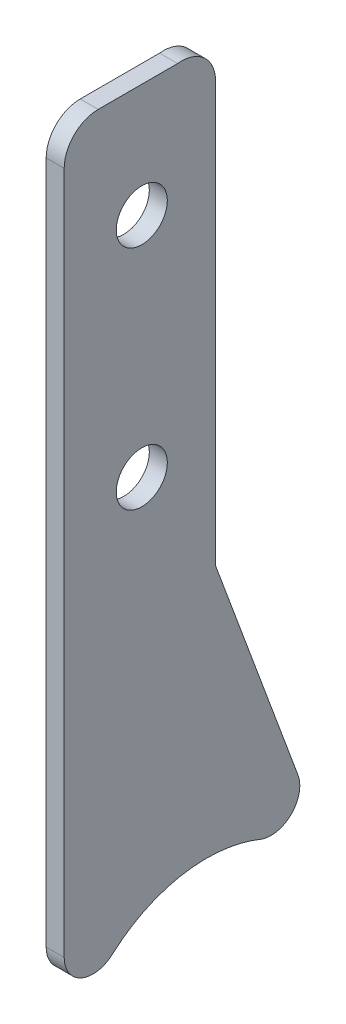
ISO-10303-21;
HEADER;
FILE_DESCRIPTION(('STEP AP214'),'2;1');
FILE_NAME('part.step','',(''),(''),'','','');
FILE_SCHEMA(('AUTOMOTIVE_DESIGN { 1 0 10303 214 1 1 1 1 }'));
ENDSEC;
DATA;
#1=APPLICATION_CONTEXT('core data for automotive mechanical design processes');
#2=APPLICATION_PROTOCOL_DEFINITION('international standard','automotive_design',2000,#1);
#3=PRODUCT_CONTEXT('',#1,'mechanical');
#4=PRODUCT('Part','Part','',(#3));
#5=PRODUCT_RELATED_PRODUCT_CATEGORY('part','',(#4));
#6=PRODUCT_DEFINITION_FORMATION('','',#4);
#7=PRODUCT_DEFINITION_CONTEXT('part definition',#1,'design');
#8=PRODUCT_DEFINITION('design','',#6,#7);
#9=PRODUCT_DEFINITION_SHAPE('','',#8);
#10=(LENGTH_UNIT() NAMED_UNIT(*) SI_UNIT(.MILLI.,.METRE.));
#11=(NAMED_UNIT(*) PLANE_ANGLE_UNIT() SI_UNIT($,.RADIAN.));
#12=(NAMED_UNIT(*) SI_UNIT($,.STERADIAN.) SOLID_ANGLE_UNIT());
#13=UNCERTAINTY_MEASURE_WITH_UNIT(LENGTH_MEASURE(1.E-05),#10,'distance_accuracy_value','');
#14=(GEOMETRIC_REPRESENTATION_CONTEXT(3) GLOBAL_UNCERTAINTY_ASSIGNED_CONTEXT((#13)) GLOBAL_UNIT_ASSIGNED_CONTEXT((#10,
#11,#12)) REPRESENTATION_CONTEXT('',''));
#15=CARTESIAN_POINT('',(0.,0.,0.));
#16=DIRECTION('',(0.,0.,1.));
#17=DIRECTION('',(1.,0.,0.));
#18=AXIS2_PLACEMENT_3D('',#15,#16,#17);
#19=CARTESIAN_POINT('',(1.5875,184.166822072846,-496.991027052738));
#20=DIRECTION('',(0.,0.347473746771921,-0.937689711634015));
#21=DIRECTION('',(0.,0.937689711634015,0.347473746771921));
#22=AXIS2_PLACEMENT_3D('',#19,#20,#21);
#23=PLANE('',#22);
#24=DIRECTION('',(0.,-0.937689711634015,-0.347473746771921));
#25=VECTOR('',#24,1.);
#26=CARTESIAN_POINT('',(1.5875,184.166822072846,-496.991027052738));
#27=LINE('',#26,#25);
#28=CARTESIAN_POINT('',(1.5875,94.5021210283801,-530.217508306128));
#29=VERTEX_POINT('',#28);
#30=CARTESIAN_POINT('',(1.5875,74.8875946446469,-537.48593931177));
#31=VERTEX_POINT('',#30);
#32=EDGE_CURVE('E120',#29,#31,#27,.T.);
#33=ORIENTED_EDGE('',*,*,#32,.T.);
#34=DIRECTION('',(1.,0.,0.));
#35=VECTOR('',#34,1.);
#36=CARTESIAN_POINT('',(0.,74.8875946446469,-537.48593931177));
#37=LINE('',#36,#35);
#38=CARTESIAN_POINT('',(0.,74.8875946446469,-537.48593931177));
#39=VERTEX_POINT('',#38);
#40=EDGE_CURVE('E12',#31,#39,#37,.F.);
#41=ORIENTED_EDGE('',*,*,#40,.T.);
#42=DIRECTION('',(0.,-0.937689711634015,-0.347473746771921));
#43=VECTOR('',#42,1.);
#44=CARTESIAN_POINT('',(0.,184.166822072846,-496.991027052738));
#45=LINE('',#44,#43);
#46=CARTESIAN_POINT('',(0.,94.5021210283801,-530.217508306128));
#47=VERTEX_POINT('',#46);
#48=EDGE_CURVE('E123',#47,#39,#45,.T.);
#49=ORIENTED_EDGE('',*,*,#48,.F.);
#50=DIRECTION('',(-1.,0.,0.));
#51=VECTOR('',#50,1.);
#52=CARTESIAN_POINT('',(1.5875,94.5021210283801,-530.217508306128));
#53=LINE('',#52,#51);
#54=EDGE_CURVE('E118',#29,#47,#53,.T.);
#55=ORIENTED_EDGE('',*,*,#54,.F.);
#56=EDGE_LOOP('',(#33,#41,#49,#55));
#57=FACE_BOUND('',#56,.T.);
#58=ADVANCED_FACE('F44',(#57),#23,.T.);
#59=CARTESIAN_POINT('',(1.5875,1.59097212373201E-12,-530.217508306128));
#60=DIRECTION('',(0.,0.,1.));
#61=DIRECTION('',(0.,-1.,0.));
#62=AXIS2_PLACEMENT_3D('',#59,#60,#61);
#63=PLANE('',#62);
#64=DIRECTION('',(0.,1.,0.));
#65=VECTOR('',#64,1.);
#66=CARTESIAN_POINT('',(0.,1.59097212373201E-12,-530.217508306128));
#67=LINE('',#66,#65);
#68=CARTESIAN_POINT('',(0.,131.50212102838,-530.217508306128));
#69=VERTEX_POINT('',#68);
#70=EDGE_CURVE('E207',#47,#69,#67,.T.);
#71=ORIENTED_EDGE('',*,*,#70,.T.);
#72=DIRECTION('',(-1.,0.,0.));
#73=VECTOR('',#72,1.);
#74=CARTESIAN_POINT('',(1.5875,131.50212102838,-530.217508306128));
#75=LINE('',#74,#73);
#76=CARTESIAN_POINT('',(1.5875,131.50212102838,-530.217508306128));
#77=VERTEX_POINT('',#76);
#78=EDGE_CURVE('E127',#77,#69,#75,.T.);
#79=ORIENTED_EDGE('',*,*,#78,.F.);
#80=DIRECTION('',(0.,1.,0.));
#81=VECTOR('',#80,1.);
#82=CARTESIAN_POINT('',(1.5875,1.59097212373201E-12,-530.217508306128));
#83=LINE('',#82,#81);
#84=EDGE_CURVE('E130',#29,#77,#83,.T.);
#85=ORIENTED_EDGE('',*,*,#84,.F.);
#86=ORIENTED_EDGE('',*,*,#54,.T.);
#87=EDGE_LOOP('',(#71,#79,#85,#86));
#88=FACE_BOUND('',#87,.T.);
#89=ADVANCED_FACE('F131',(#88),#63,.F.);
#90=CARTESIAN_POINT('',(1.5875,131.521457606697,-527.217570623985));
#91=DIRECTION('',(-1.,0.,0.));
#92=DIRECTION('',(0.,0.,1.));
#93=AXIS2_PLACEMENT_3D('',#90,#91,#92);
#94=CYLINDRICAL_SURFACE('',#93,3.);
#95=CARTESIAN_POINT('',(0.,131.521457606697,-527.217570623985));
#96=DIRECTION('',(1.,0.,0.));
#97=DIRECTION('',(0.,0.,-1.));
#98=AXIS2_PLACEMENT_3D('',#95,#96,#97);
#99=CIRCLE('',#98,3.);
#100=CARTESIAN_POINT('',(0.,134.50212102838,-526.877503620822));
#101=VERTEX_POINT('',#100);
#102=EDGE_CURVE('E205',#69,#101,#99,.T.);
#103=ORIENTED_EDGE('',*,*,#102,.T.);
#104=DIRECTION('',(-1.,0.,0.));
#105=VECTOR('',#104,1.);
#106=CARTESIAN_POINT('',(1.5875,134.50212102838,-526.877503620822));
#107=LINE('',#106,#105);
#108=CARTESIAN_POINT('',(1.5875,134.50212102838,-526.877503620822));
#109=VERTEX_POINT('',#108);
#110=EDGE_CURVE('E186',#109,#101,#107,.T.);
#111=ORIENTED_EDGE('',*,*,#110,.F.);
#112=CARTESIAN_POINT('',(1.5875,131.521457606697,-527.217570623985));
#113=DIRECTION('',(1.,0.,0.));
#114=DIRECTION('',(0.,0.,-1.));
#115=AXIS2_PLACEMENT_3D('',#112,#113,#114);
#116=CIRCLE('',#115,3.);
#117=EDGE_CURVE('E134',#77,#109,#116,.T.);
#118=ORIENTED_EDGE('',*,*,#117,.F.);
#119=ORIENTED_EDGE('',*,*,#78,.T.);
#120=EDGE_LOOP('',(#103,#111,#118,#119));
#121=FACE_BOUND('',#120,.T.);
#122=ADVANCED_FACE('F249',(#121),#94,.T.);
#123=CARTESIAN_POINT('',(1.5875,134.502121028378,5.33311970095088E-13));
#124=DIRECTION('',(0.,-1.,0.));
#125=DIRECTION('',(0.,0.,-1.));
#126=AXIS2_PLACEMENT_3D('',#123,#124,#125);
#127=PLANE('',#126);
#128=DIRECTION('',(0.,0.,1.));
#129=VECTOR('',#128,1.);
#130=CARTESIAN_POINT('',(0.,134.502121028378,5.33311970095088E-13));
#131=LINE('',#130,#129);
#132=CARTESIAN_POINT('',(0.,134.50212102838,-519.877503620822));
#133=VERTEX_POINT('',#132);
#134=EDGE_CURVE('E203',#101,#133,#131,.T.);
#135=ORIENTED_EDGE('',*,*,#134,.T.);
#136=DIRECTION('',(-1.,0.,0.));
#137=VECTOR('',#136,1.);
#138=CARTESIAN_POINT('',(1.5875,134.50212102838,-519.877503620822));
#139=LINE('',#138,#137);
#140=CARTESIAN_POINT('',(1.5875,134.50212102838,-519.877503620822));
#141=VERTEX_POINT('',#140);
#142=EDGE_CURVE('E189',#141,#133,#139,.T.);
#143=ORIENTED_EDGE('',*,*,#142,.F.);
#144=DIRECTION('',(0.,0.,1.));
#145=VECTOR('',#144,1.);
#146=CARTESIAN_POINT('',(1.5875,134.502121028378,5.33311970095088E-13));
#147=LINE('',#146,#145);
#148=EDGE_CURVE('E156',#109,#141,#147,.T.);
#149=ORIENTED_EDGE('',*,*,#148,.F.);
#150=ORIENTED_EDGE('',*,*,#110,.T.);
#151=EDGE_LOOP('',(#135,#143,#149,#150));
#152=FACE_BOUND('',#151,.T.);
#153=ADVANCED_FACE('F274',(#152),#127,.F.);
#154=CARTESIAN_POINT('',(1.5875,131.50212102838,-519.877503620822));
#155=DIRECTION('',(-1.,0.,0.));
#156=DIRECTION('',(0.,0.,1.));
#157=AXIS2_PLACEMENT_3D('',#154,#155,#156);
#158=CYLINDRICAL_SURFACE('',#157,3.00000000000006);
#159=CARTESIAN_POINT('',(0.,131.50212102838,-519.877503620822));
#160=DIRECTION('',(1.,0.,0.));
#161=DIRECTION('',(0.,0.,-1.));
#162=AXIS2_PLACEMENT_3D('',#159,#160,#161);
#163=CIRCLE('',#162,3.00000000000006);
#164=CARTESIAN_POINT('',(0.,131.50212102838,-516.877503620822));
#165=VERTEX_POINT('',#164);
#166=EDGE_CURVE('E201',#133,#165,#163,.T.);
#167=ORIENTED_EDGE('',*,*,#166,.T.);
#168=DIRECTION('',(-1.,0.,0.));
#169=VECTOR('',#168,1.);
#170=CARTESIAN_POINT('',(1.5875,131.50212102838,-516.877503620822));
#171=LINE('',#170,#169);
#172=CARTESIAN_POINT('',(1.5875,131.50212102838,-516.877503620822));
#173=VERTEX_POINT('',#172);
#174=EDGE_CURVE('E192',#173,#165,#171,.T.);
#175=ORIENTED_EDGE('',*,*,#174,.F.);
#176=CARTESIAN_POINT('',(1.5875,131.50212102838,-519.877503620822));
#177=DIRECTION('',(1.,0.,0.));
#178=DIRECTION('',(0.,0.,-1.));
#179=AXIS2_PLACEMENT_3D('',#176,#177,#178);
#180=CIRCLE('',#179,3.00000000000006);
#181=EDGE_CURVE('E158',#141,#173,#180,.T.);
#182=ORIENTED_EDGE('',*,*,#181,.F.);
#183=ORIENTED_EDGE('',*,*,#142,.T.);
#184=EDGE_LOOP('',(#167,#175,#182,#183));
#185=FACE_BOUND('',#184,.T.);
#186=ADVANCED_FACE('F269',(#185),#158,.T.);
#187=CARTESIAN_POINT('',(1.5875,0.,-516.877503620822));
#188=DIRECTION('',(0.,0.,-1.));
#189=DIRECTION('',(-1.,0.,0.));
#190=AXIS2_PLACEMENT_3D('',#187,#188,#189);
#191=PLANE('',#190);
#192=DIRECTION('',(0.,-1.,0.));
#193=VECTOR('',#192,1.);
#194=CARTESIAN_POINT('',(0.,0.,-516.877503620822));
#195=LINE('',#194,#193);
#196=CARTESIAN_POINT('',(0.,71.275593157129,-516.877503620822));
#197=VERTEX_POINT('',#196);
#198=EDGE_CURVE('E140',#165,#197,#195,.T.);
#199=ORIENTED_EDGE('',*,*,#198,.T.);
#200=DIRECTION('',(-1.,0.,0.));
#201=VECTOR('',#200,1.);
#202=CARTESIAN_POINT('',(1.5875,71.275593157129,-516.877503620822));
#203=LINE('',#202,#201);
#204=CARTESIAN_POINT('',(1.5875,71.275593157129,-516.877503620822));
#205=VERTEX_POINT('',#204);
#206=EDGE_CURVE('E67',#197,#205,#203,.F.);
#207=ORIENTED_EDGE('',*,*,#206,.T.);
#208=DIRECTION('',(0.,-1.,0.));
#209=VECTOR('',#208,1.);
#210=CARTESIAN_POINT('',(1.5875,0.,-516.877503620822));
#211=LINE('',#210,#209);
#212=EDGE_CURVE('E161',#173,#205,#211,.T.);
#213=ORIENTED_EDGE('',*,*,#212,.F.);
#214=ORIENTED_EDGE('',*,*,#174,.T.);
#215=EDGE_LOOP('',(#199,#207,#213,#214));
#216=FACE_BOUND('',#215,.T.);
#217=ADVANCED_FACE('F240',(#216),#191,.F.);
#218=CARTESIAN_POINT('',(1.5875,71.9358138584418,-525.494944029399));
#219=CARTESIAN_POINT('',(1.5875,79.9679991152706,-549.591499799882));
#220=CARTESIAN_POINT('',(1.5875,55.2852450341221,-557.819084493599));
#221=CARTESIAN_POINT('',(1.5875,47.2530597772933,-533.722528723116));
#222=CARTESIAN_POINT('',(1.5875,39.2208745204644,-509.625972952634));
#223=CARTESIAN_POINT('',(1.5875,63.9036286016129,-501.398388258916));
#224=CARTESIAN_POINT('',(1.5875,71.9358138584418,-525.494944029399));
#225=(BOUNDED_CURVE() B_SPLINE_CURVE(3,(#218,#219,#220,#221,#222,#223,#224),.UNSPECIFIED.,.T.,
.F.) B_SPLINE_CURVE_WITH_KNOTS((4,3,4),(0.,0.5,1.),
.UNSPECIFIED.) CURVE() GEOMETRIC_REPRESENTATION_ITEM() RATIONAL_B_SPLINE_CURVE((1.,
0.333333333333333,0.333333333333333,1.,0.333333333333333,0.333333333333333,1.)) REPRESENTATION_ITEM(''));
#226=DIRECTION('',(-1.,0.,0.));
#227=VECTOR('',#226,1.);
#228=SURFACE_OF_LINEAR_EXTRUSION('',#225,#227);
#229=CARTESIAN_POINT('',(1.5875,69.3859699274089,-521.11483212459));
#230=VERTEX_POINT('',#229);
#231=CARTESIAN_POINT('',(1.5875,71.6500546389805,-534.152483222837));
#232=VERTEX_POINT('',#231);
#233=EDGE_CURVE('E164',#230,#232,#225,.T.);
#234=ORIENTED_EDGE('',*,*,#233,.F.);
#235=DIRECTION('',(-1.,0.,0.));
#236=VECTOR('',#235,1.);
#237=CARTESIAN_POINT('',(1.5875,69.3859699274088,-521.11483212459));
#238=LINE('',#237,#236);
#239=CARTESIAN_POINT('',(0.,69.3859699274086,-521.11483212459));
#240=VERTEX_POINT('',#239);
#241=EDGE_CURVE('E181',#230,#240,#238,.T.);
#242=ORIENTED_EDGE('',*,*,#241,.T.);
#243=CARTESIAN_POINT('',(0.,71.9358138584418,-525.494944029399));
#244=CARTESIAN_POINT('',(0.,79.9679991152706,-549.591499799882));
#245=CARTESIAN_POINT('',(0.,55.2852450341221,-557.819084493599));
#246=CARTESIAN_POINT('',(0.,47.2530597772933,-533.722528723116));
#247=CARTESIAN_POINT('',(0.,39.2208745204644,-509.625972952634));
#248=CARTESIAN_POINT('',(0.,63.9036286016129,-501.398388258916));
#249=CARTESIAN_POINT('',(0.,71.9358138584418,-525.494944029399));
#250=(BOUNDED_CURVE() B_SPLINE_CURVE(3,(#243,#244,#245,#246,#247,#248,#249),.UNSPECIFIED.,.T.,
.F.) B_SPLINE_CURVE_WITH_KNOTS((4,3,4),(0.,0.5,1.),
.UNSPECIFIED.) CURVE() GEOMETRIC_REPRESENTATION_ITEM() RATIONAL_B_SPLINE_CURVE((1.,
0.333333333333333,0.333333333333333,1.,0.333333333333333,0.333333333333333,1.)) REPRESENTATION_ITEM(''));
#251=CARTESIAN_POINT('',(0.,71.6500546389804,-534.152483222838));
#252=VERTEX_POINT('',#251);
#253=EDGE_CURVE('E137',#240,#252,#250,.T.);
#254=ORIENTED_EDGE('',*,*,#253,.T.);
#255=DIRECTION('',(-1.,0.,0.));
#256=VECTOR('',#255,1.);
#257=CARTESIAN_POINT('',(0.,71.6500546389837,-534.152483222829));
#258=LINE('',#257,#256);
#259=EDGE_CURVE('E126',#252,#232,#258,.F.);
#260=ORIENTED_EDGE('',*,*,#259,.T.);
#261=EDGE_LOOP('',(#234,#242,#254,#260));
#262=FACE_BOUND('',#261,.T.);
#263=ADVANCED_FACE('F231',(#262),#228,.F.);
#264=CARTESIAN_POINT('',(1.5875,0.,0.));
#265=DIRECTION('',(1.,0.,0.));
#266=DIRECTION('',(0.,0.,-1.));
#267=AXIS2_PLACEMENT_3D('',#264,#265,#266);
#268=PLANE('',#267);
#269=CARTESIAN_POINT('',(1.5875,124.50212102838,-523.717508306128));
#270=DIRECTION('',(1.,0.,0.));
#271=DIRECTION('',(0.,0.,-1.));
#272=AXIS2_PLACEMENT_3D('',#269,#270,#271);
#273=CIRCLE('',#272,2.25);
#274=CARTESIAN_POINT('',(1.5875,124.50212102838,-525.967508306128));
#275=VERTEX_POINT('',#274);
#276=EDGE_CURVE('E218',#275,#275,#273,.T.);
#277=ORIENTED_EDGE('',*,*,#276,.F.);
#278=EDGE_LOOP('',(#277));
#279=FACE_BOUND('',#278,.T.);
#280=CARTESIAN_POINT('',(1.5875,104.50212102838,-523.717508306128));
#281=DIRECTION('',(1.,0.,0.));
#282=DIRECTION('',(0.,0.,-1.));
#283=AXIS2_PLACEMENT_3D('',#280,#281,#282);
#284=CIRCLE('',#283,2.24999999999999);
#285=CARTESIAN_POINT('',(1.5875,104.50212102838,-525.967508306128));
#286=VERTEX_POINT('',#285);
#287=EDGE_CURVE('E210',#286,#286,#284,.T.);
#288=ORIENTED_EDGE('',*,*,#287,.F.);
#289=EDGE_LOOP('',(#288));
#290=FACE_BOUND('',#289,.T.);
#291=ORIENTED_EDGE('',*,*,#212,.T.);
#292=CARTESIAN_POINT('',(1.5875,71.275593157129,-519.417503620822));
#293=DIRECTION('',(1.,0.,0.));
#294=DIRECTION('',(0.,0.,-1.));
#295=AXIS2_PLACEMENT_3D('',#292,#293,#294);
#296=CIRCLE('',#295,2.54);
#297=EDGE_CURVE('E52',#205,#230,#296,.T.);
#298=ORIENTED_EDGE('',*,*,#297,.T.);
#299=ORIENTED_EDGE('',*,*,#233,.T.);
#300=CARTESIAN_POINT('',(1.5875,74.0050113278461,-535.10420744422));
#301=DIRECTION('',(1.,0.,0.));
#302=DIRECTION('',(0.,0.,-1.));
#303=AXIS2_PLACEMENT_3D('',#300,#301,#302);
#304=CIRCLE('',#303,2.54);
#305=EDGE_CURVE('E59',#232,#31,#304,.T.);
#306=ORIENTED_EDGE('',*,*,#305,.T.);
#307=ORIENTED_EDGE('',*,*,#32,.F.);
#308=ORIENTED_EDGE('',*,*,#84,.T.);
#309=ORIENTED_EDGE('',*,*,#117,.T.);
#310=ORIENTED_EDGE('',*,*,#148,.T.);
#311=ORIENTED_EDGE('',*,*,#181,.T.);
#312=EDGE_LOOP('',(#291,#298,#299,#306,#307,#308,#309,#310,#311));
#313=FACE_BOUND('',#312,.T.);
#314=ADVANCED_FACE('F136',(#279,#290,#313),#268,.T.);
#315=CARTESIAN_POINT('',(0.,0.,0.));
#316=DIRECTION('',(1.,0.,0.));
#317=DIRECTION('',(0.,0.,-1.));
#318=AXIS2_PLACEMENT_3D('',#315,#316,#317);
#319=PLANE('',#318);
#320=CARTESIAN_POINT('',(0.,124.50212102838,-523.717508306128));
#321=DIRECTION('',(1.,0.,0.));
#322=DIRECTION('',(0.,0.,-1.));
#323=AXIS2_PLACEMENT_3D('',#320,#321,#322);
#324=CIRCLE('',#323,2.25);
#325=CARTESIAN_POINT('',(0.,124.50212102838,-525.967508306128));
#326=VERTEX_POINT('',#325);
#327=EDGE_CURVE('E214',#326,#326,#324,.T.);
#328=ORIENTED_EDGE('',*,*,#327,.T.);
#329=EDGE_LOOP('',(#328));
#330=FACE_BOUND('',#329,.T.);
#331=CARTESIAN_POINT('',(0.,104.50212102838,-523.717508306128));
#332=DIRECTION('',(1.,0.,0.));
#333=DIRECTION('',(0.,0.,-1.));
#334=AXIS2_PLACEMENT_3D('',#331,#332,#333);
#335=CIRCLE('',#334,2.25);
#336=CARTESIAN_POINT('',(0.,104.50212102838,-525.967508306128));
#337=VERTEX_POINT('',#336);
#338=EDGE_CURVE('E144',#337,#337,#335,.T.);
#339=ORIENTED_EDGE('',*,*,#338,.T.);
#340=EDGE_LOOP('',(#339));
#341=FACE_BOUND('',#340,.T.);
#342=ORIENTED_EDGE('',*,*,#253,.F.);
#343=CARTESIAN_POINT('',(0.,71.275593157129,-519.417503620822));
#344=DIRECTION('',(1.,0.,0.));
#345=DIRECTION('',(0.,0.,-1.));
#346=AXIS2_PLACEMENT_3D('',#343,#344,#345);
#347=CIRCLE('',#346,2.54);
#348=EDGE_CURVE('E177',#240,#197,#347,.F.);
#349=ORIENTED_EDGE('',*,*,#348,.T.);
#350=ORIENTED_EDGE('',*,*,#198,.F.);
#351=ORIENTED_EDGE('',*,*,#166,.F.);
#352=ORIENTED_EDGE('',*,*,#134,.F.);
#353=ORIENTED_EDGE('',*,*,#102,.F.);
#354=ORIENTED_EDGE('',*,*,#70,.F.);
#355=ORIENTED_EDGE('',*,*,#48,.T.);
#356=CARTESIAN_POINT('',(0.,74.0050113278461,-535.10420744422));
#357=DIRECTION('',(1.,0.,0.));
#358=DIRECTION('',(0.,0.,-1.));
#359=AXIS2_PLACEMENT_3D('',#356,#357,#358);
#360=CIRCLE('',#359,2.54);
#361=EDGE_CURVE('E179',#39,#252,#360,.F.);
#362=ORIENTED_EDGE('',*,*,#361,.T.);
#363=EDGE_LOOP('',(#342,#349,#350,#351,#352,#353,#354,#355,#362));
#364=FACE_BOUND('',#363,.T.);
#365=ADVANCED_FACE('F230',(#330,#341,#364),#319,.F.);
#366=CARTESIAN_POINT('',(0.79375,71.275593157129,-519.417503620822));
#367=DIRECTION('',(-1.,0.,0.));
#368=DIRECTION('',(0.,0.,1.));
#369=AXIS2_PLACEMENT_3D('',#366,#367,#368);
#370=CYLINDRICAL_SURFACE('',#369,2.54);
#371=ORIENTED_EDGE('',*,*,#297,.F.);
#372=ORIENTED_EDGE('',*,*,#206,.F.);
#373=ORIENTED_EDGE('',*,*,#348,.F.);
#374=ORIENTED_EDGE('',*,*,#241,.F.);
#375=EDGE_LOOP('',(#371,#372,#373,#374));
#376=FACE_BOUND('',#375,.T.);
#377=ADVANCED_FACE('F237',(#376),#370,.T.);
#378=CARTESIAN_POINT('',(0.79375,74.0050113278461,-535.10420744422));
#379=DIRECTION('',(-1.,0.,0.));
#380=DIRECTION('',(0.,0.,1.));
#381=AXIS2_PLACEMENT_3D('',#378,#379,#380);
#382=CYLINDRICAL_SURFACE('',#381,2.54);
#383=ORIENTED_EDGE('',*,*,#305,.F.);
#384=ORIENTED_EDGE('',*,*,#259,.F.);
#385=ORIENTED_EDGE('',*,*,#361,.F.);
#386=ORIENTED_EDGE('',*,*,#40,.F.);
#387=EDGE_LOOP('',(#383,#384,#385,#386));
#388=FACE_BOUND('',#387,.T.);
#389=ADVANCED_FACE('F46',(#388),#382,.T.);
#390=CARTESIAN_POINT('',(1.5875,104.50212102838,-523.717508306128));
#391=DIRECTION('',(1.,0.,0.));
#392=DIRECTION('',(0.,0.,-1.));
#393=AXIS2_PLACEMENT_3D('',#390,#391,#392);
#394=CYLINDRICAL_SURFACE('',#393,2.25);
#395=ORIENTED_EDGE('',*,*,#338,.F.);
#396=EDGE_LOOP('',(#395));
#397=FACE_BOUND('',#396,.T.);
#398=ORIENTED_EDGE('',*,*,#287,.T.);
#399=EDGE_LOOP('',(#398));
#400=FACE_BOUND('',#399,.T.);
#401=ADVANCED_FACE('F257',(#397,#400),#394,.F.);
#402=CARTESIAN_POINT('',(1.5875,124.50212102838,-523.717508306128));
#403=DIRECTION('',(1.,0.,0.));
#404=DIRECTION('',(0.,0.,-1.));
#405=AXIS2_PLACEMENT_3D('',#402,#403,#404);
#406=CYLINDRICAL_SURFACE('',#405,2.25);
#407=ORIENTED_EDGE('',*,*,#327,.F.);
#408=EDGE_LOOP('',(#407));
#409=FACE_BOUND('',#408,.T.);
#410=ORIENTED_EDGE('',*,*,#276,.T.);
#411=EDGE_LOOP('',(#410));
#412=FACE_BOUND('',#411,.T.);
#413=ADVANCED_FACE('F226',(#409,#412),#406,.F.);
#414=CLOSED_SHELL('',(#58,#89,#122,#153,#186,#217,#263,#314,#365,#377,#389,#401,#413));
#415=MANIFOLD_SOLID_BREP('B2',#414);
#416=ADVANCED_BREP_SHAPE_REPRESENTATION('',(#18,#415),#14);
#417=SHAPE_DEFINITION_REPRESENTATION(#9,#416);
ENDSEC;
END-ISO-10303-21;
